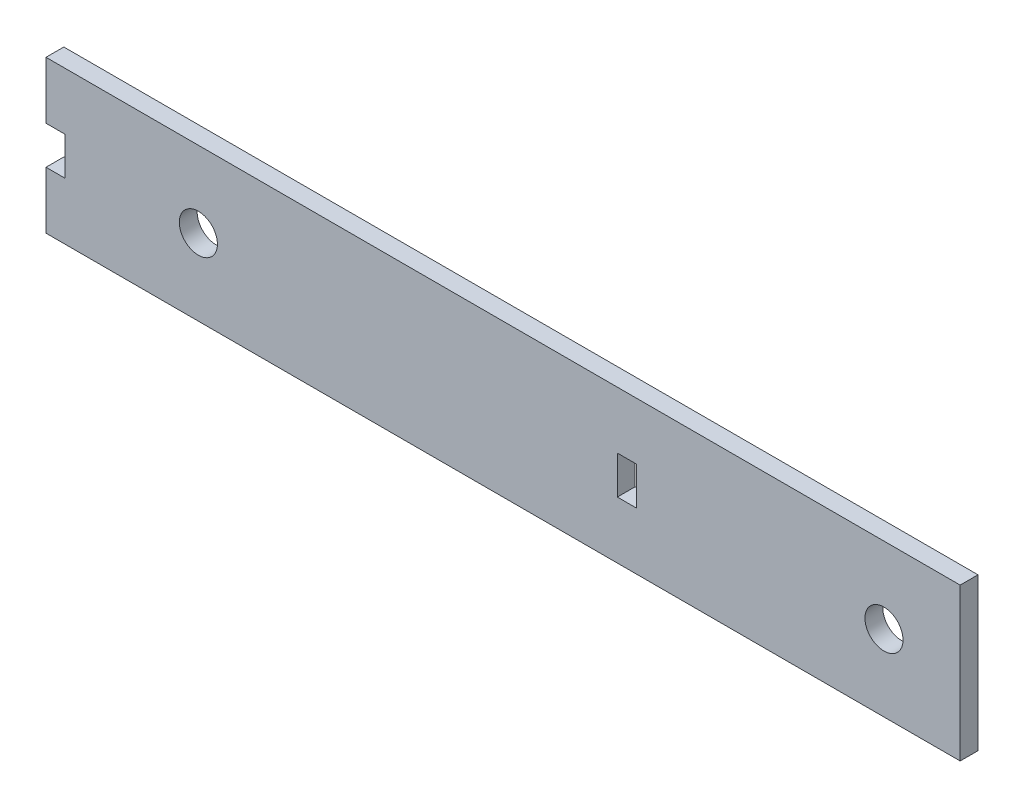
ISO-10303-21;
HEADER;
FILE_DESCRIPTION(('STEP AP214'),'2;1');
FILE_NAME('part.step','',(''),(''),'','','');
FILE_SCHEMA(('AUTOMOTIVE_DESIGN { 1 0 10303 214 1 1 1 1 }'));
ENDSEC;
DATA;
#1=APPLICATION_CONTEXT('core data for automotive mechanical design processes');
#2=APPLICATION_PROTOCOL_DEFINITION('international standard','automotive_design',2000,#1);
#3=PRODUCT_CONTEXT('',#1,'mechanical');
#4=PRODUCT('Part','Part','',(#3));
#5=PRODUCT_RELATED_PRODUCT_CATEGORY('part','',(#4));
#6=PRODUCT_DEFINITION_FORMATION('','',#4);
#7=PRODUCT_DEFINITION_CONTEXT('part definition',#1,'design');
#8=PRODUCT_DEFINITION('design','',#6,#7);
#9=PRODUCT_DEFINITION_SHAPE('','',#8);
#10=(LENGTH_UNIT() NAMED_UNIT(*) SI_UNIT(.MILLI.,.METRE.));
#11=(NAMED_UNIT(*) PLANE_ANGLE_UNIT() SI_UNIT($,.RADIAN.));
#12=(NAMED_UNIT(*) SI_UNIT($,.STERADIAN.) SOLID_ANGLE_UNIT());
#13=UNCERTAINTY_MEASURE_WITH_UNIT(LENGTH_MEASURE(1.E-05),#10,'distance_accuracy_value','');
#14=(GEOMETRIC_REPRESENTATION_CONTEXT(3) GLOBAL_UNCERTAINTY_ASSIGNED_CONTEXT((#13)) GLOBAL_UNIT_ASSIGNED_CONTEXT((#10,
#11,#12)) REPRESENTATION_CONTEXT('',''));
#15=CARTESIAN_POINT('',(0.,0.,0.));
#16=DIRECTION('',(0.,0.,1.));
#17=DIRECTION('',(1.,0.,0.));
#18=AXIS2_PLACEMENT_3D('',#15,#16,#17);
#19=CARTESIAN_POINT('',(-76.2,-12.7,2.9718));
#20=DIRECTION('',(1.,0.,0.));
#21=DIRECTION('',(0.,0.,-1.));
#22=AXIS2_PLACEMENT_3D('',#19,#20,#21);
#23=PLANE('',#22);
#24=DIRECTION('',(0.,-1.,0.));
#25=VECTOR('',#24,1.);
#26=CARTESIAN_POINT('',(-76.2,-12.7,2.9718));
#27=LINE('',#26,#25);
#28=CARTESIAN_POINT('',(-76.2,-3.175,2.9718));
#29=VERTEX_POINT('',#28);
#30=CARTESIAN_POINT('',(-76.2,-12.7,2.9718));
#31=VERTEX_POINT('',#30);
#32=EDGE_CURVE('E208',#29,#31,#27,.T.);
#33=ORIENTED_EDGE('',*,*,#32,.F.);
#34=DIRECTION('',(0.,0.,-1.));
#35=VECTOR('',#34,1.);
#36=CARTESIAN_POINT('',(-76.2,-3.175,2.9718));
#37=LINE('',#36,#35);
#38=CARTESIAN_POINT('',(-76.2,-3.175,0.));
#39=VERTEX_POINT('',#38);
#40=EDGE_CURVE('E201',#29,#39,#37,.T.);
#41=ORIENTED_EDGE('',*,*,#40,.T.);
#42=DIRECTION('',(0.,-1.,0.));
#43=VECTOR('',#42,1.);
#44=CARTESIAN_POINT('',(-76.2,-12.7,0.));
#45=LINE('',#44,#43);
#46=CARTESIAN_POINT('',(-76.2,-12.7,0.));
#47=VERTEX_POINT('',#46);
#48=EDGE_CURVE('E220',#39,#47,#45,.T.);
#49=ORIENTED_EDGE('',*,*,#48,.T.);
#50=DIRECTION('',(0.,0.,-1.));
#51=VECTOR('',#50,1.);
#52=CARTESIAN_POINT('',(-76.2,-12.7,2.9718));
#53=LINE('',#52,#51);
#54=EDGE_CURVE('E231',#31,#47,#53,.T.);
#55=ORIENTED_EDGE('',*,*,#54,.F.);
#56=EDGE_LOOP('',(#33,#41,#49,#55));
#57=FACE_BOUND('',#56,.T.);
#58=ADVANCED_FACE('F41',(#57),#23,.F.);
#59=CARTESIAN_POINT('',(-76.2,12.7,2.9718));
#60=DIRECTION('',(0.,-1.,0.));
#61=DIRECTION('',(1.,0.,0.));
#62=AXIS2_PLACEMENT_3D('',#59,#60,#61);
#63=PLANE('',#62);
#64=DIRECTION('',(-1.,0.,0.));
#65=VECTOR('',#64,1.);
#66=CARTESIAN_POINT('',(-76.2,12.7,0.));
#67=LINE('',#66,#65);
#68=CARTESIAN_POINT('',(76.2,12.7,0.));
#69=VERTEX_POINT('',#68);
#70=CARTESIAN_POINT('',(-76.2,12.7,0.));
#71=VERTEX_POINT('',#70);
#72=EDGE_CURVE('E204',#69,#71,#67,.T.);
#73=ORIENTED_EDGE('',*,*,#72,.T.);
#74=DIRECTION('',(0.,0.,-1.));
#75=VECTOR('',#74,1.);
#76=CARTESIAN_POINT('',(-76.2,12.7,2.9718));
#77=LINE('',#76,#75);
#78=CARTESIAN_POINT('',(-76.2,12.7,2.9718));
#79=VERTEX_POINT('',#78);
#80=EDGE_CURVE('E49',#79,#71,#77,.T.);
#81=ORIENTED_EDGE('',*,*,#80,.F.);
#82=DIRECTION('',(-1.,0.,0.));
#83=VECTOR('',#82,1.);
#84=CARTESIAN_POINT('',(-76.2,12.7,2.9718));
#85=LINE('',#84,#83);
#86=CARTESIAN_POINT('',(76.2,12.7,2.9718));
#87=VERTEX_POINT('',#86);
#88=EDGE_CURVE('E205',#87,#79,#85,.T.);
#89=ORIENTED_EDGE('',*,*,#88,.F.);
#90=DIRECTION('',(0.,0.,-1.));
#91=VECTOR('',#90,1.);
#92=CARTESIAN_POINT('',(76.2,12.7,2.9718));
#93=LINE('',#92,#91);
#94=EDGE_CURVE('E217',#87,#69,#93,.T.);
#95=ORIENTED_EDGE('',*,*,#94,.T.);
#96=EDGE_LOOP('',(#73,#81,#89,#95));
#97=FACE_BOUND('',#96,.T.);
#98=ADVANCED_FACE('F43',(#97),#63,.F.);
#99=CARTESIAN_POINT('',(-76.2,3.175,0.));
#100=VERTEX_POINT('',#99);
#101=EDGE_CURVE('E221',#71,#100,#45,.T.);
#102=ORIENTED_EDGE('',*,*,#101,.T.);
#103=DIRECTION('',(0.,0.,1.));
#104=VECTOR('',#103,1.);
#105=CARTESIAN_POINT('',(-76.2,3.175,2.9718));
#106=LINE('',#105,#104);
#107=CARTESIAN_POINT('',(-76.2,3.175,2.9718));
#108=VERTEX_POINT('',#107);
#109=EDGE_CURVE('E146',#100,#108,#106,.T.);
#110=ORIENTED_EDGE('',*,*,#109,.T.);
#111=EDGE_CURVE('E210',#79,#108,#27,.T.);
#112=ORIENTED_EDGE('',*,*,#111,.F.);
#113=ORIENTED_EDGE('',*,*,#80,.T.);
#114=EDGE_LOOP('',(#102,#110,#112,#113));
#115=FACE_BOUND('',#114,.T.);
#116=ADVANCED_FACE('F236',(#115),#23,.F.);
#117=CARTESIAN_POINT('',(-76.2,-12.7,2.9718));
#118=DIRECTION('',(0.,1.,0.));
#119=DIRECTION('',(-1.,0.,0.));
#120=AXIS2_PLACEMENT_3D('',#117,#118,#119);
#121=PLANE('',#120);
#122=DIRECTION('',(1.,0.,0.));
#123=VECTOR('',#122,1.);
#124=CARTESIAN_POINT('',(-76.2,-12.7,0.));
#125=LINE('',#124,#123);
#126=CARTESIAN_POINT('',(76.2,-12.7,0.));
#127=VERTEX_POINT('',#126);
#128=EDGE_CURVE('E223',#47,#127,#125,.T.);
#129=ORIENTED_EDGE('',*,*,#128,.T.);
#130=DIRECTION('',(0.,0.,-1.));
#131=VECTOR('',#130,1.);
#132=CARTESIAN_POINT('',(76.2,-12.7,2.9718));
#133=LINE('',#132,#131);
#134=CARTESIAN_POINT('',(76.2,-12.7,2.9718));
#135=VERTEX_POINT('',#134);
#136=EDGE_CURVE('E228',#135,#127,#133,.T.);
#137=ORIENTED_EDGE('',*,*,#136,.F.);
#138=DIRECTION('',(1.,0.,0.));
#139=VECTOR('',#138,1.);
#140=CARTESIAN_POINT('',(-76.2,-12.7,2.9718));
#141=LINE('',#140,#139);
#142=EDGE_CURVE('E213',#31,#135,#141,.T.);
#143=ORIENTED_EDGE('',*,*,#142,.F.);
#144=ORIENTED_EDGE('',*,*,#54,.T.);
#145=EDGE_LOOP('',(#129,#137,#143,#144));
#146=FACE_BOUND('',#145,.T.);
#147=ADVANCED_FACE('F249',(#146),#121,.F.);
#148=CARTESIAN_POINT('',(76.2,-12.7,2.9718));
#149=DIRECTION('',(-1.,0.,0.));
#150=DIRECTION('',(0.,0.,1.));
#151=AXIS2_PLACEMENT_3D('',#148,#149,#150);
#152=PLANE('',#151);
#153=DIRECTION('',(0.,1.,0.));
#154=VECTOR('',#153,1.);
#155=CARTESIAN_POINT('',(76.2,-12.7,0.));
#156=LINE('',#155,#154);
#157=EDGE_CURVE('E209',#127,#69,#156,.T.);
#158=ORIENTED_EDGE('',*,*,#157,.T.);
#159=ORIENTED_EDGE('',*,*,#94,.F.);
#160=DIRECTION('',(0.,1.,0.));
#161=VECTOR('',#160,1.);
#162=CARTESIAN_POINT('',(76.2,-12.7,2.9718));
#163=LINE('',#162,#161);
#164=EDGE_CURVE('E215',#135,#87,#163,.T.);
#165=ORIENTED_EDGE('',*,*,#164,.F.);
#166=ORIENTED_EDGE('',*,*,#136,.T.);
#167=EDGE_LOOP('',(#158,#159,#165,#166));
#168=FACE_BOUND('',#167,.T.);
#169=ADVANCED_FACE('F244',(#168),#152,.F.);
#170=CARTESIAN_POINT('',(0.,0.,2.9718));
#171=DIRECTION('',(0.,0.,1.));
#172=DIRECTION('',(1.,0.,0.));
#173=AXIS2_PLACEMENT_3D('',#170,#171,#172);
#174=PLANE('',#173);
#175=DIRECTION('',(1.,0.,0.));
#176=VECTOR('',#175,1.);
#177=CARTESIAN_POINT('',(-79.375,-3.175,2.9718));
#178=LINE('',#177,#176);
#179=CARTESIAN_POINT('',(-73.025,-3.175,2.9718));
#180=VERTEX_POINT('',#179);
#181=EDGE_CURVE('E152',#29,#180,#178,.T.);
#182=ORIENTED_EDGE('',*,*,#181,.F.);
#183=ORIENTED_EDGE('',*,*,#32,.T.);
#184=ORIENTED_EDGE('',*,*,#142,.T.);
#185=ORIENTED_EDGE('',*,*,#164,.T.);
#186=ORIENTED_EDGE('',*,*,#88,.T.);
#187=ORIENTED_EDGE('',*,*,#111,.T.);
#188=DIRECTION('',(-1.,0.,0.));
#189=VECTOR('',#188,1.);
#190=CARTESIAN_POINT('',(-79.375,3.175,2.9718));
#191=LINE('',#190,#189);
#192=CARTESIAN_POINT('',(-73.025,3.175,2.9718));
#193=VERTEX_POINT('',#192);
#194=EDGE_CURVE('E154',#193,#108,#191,.T.);
#195=ORIENTED_EDGE('',*,*,#194,.F.);
#196=DIRECTION('',(0.,1.,0.));
#197=VECTOR('',#196,1.);
#198=CARTESIAN_POINT('',(-73.025,-3.175,2.9718));
#199=LINE('',#198,#197);
#200=EDGE_CURVE('E137',#180,#193,#199,.T.);
#201=ORIENTED_EDGE('',*,*,#200,.F.);
#202=EDGE_LOOP('',(#182,#183,#184,#185,#186,#187,#195,#201));
#203=FACE_BOUND('',#202,.T.);
#204=DIRECTION('',(0.,1.,0.));
#205=VECTOR('',#204,1.);
#206=CARTESIAN_POINT('',(22.225,-3.16649195279477,2.9718));
#207=LINE('',#206,#205);
#208=CARTESIAN_POINT('',(22.225,-3.16649195279477,2.9718));
#209=VERTEX_POINT('',#208);
#210=CARTESIAN_POINT('',(22.225,3.18350804720523,2.9718));
#211=VERTEX_POINT('',#210);
#212=EDGE_CURVE('E56',#209,#211,#207,.T.);
#213=ORIENTED_EDGE('',*,*,#212,.F.);
#214=DIRECTION('',(1.,0.,0.));
#215=VECTOR('',#214,1.);
#216=CARTESIAN_POINT('',(19.05,-3.16649195279477,2.9718));
#217=LINE('',#216,#215);
#218=CARTESIAN_POINT('',(19.05,-3.16649195279477,2.9718));
#219=VERTEX_POINT('',#218);
#220=EDGE_CURVE('E170',#219,#209,#217,.T.);
#221=ORIENTED_EDGE('',*,*,#220,.F.);
#222=DIRECTION('',(0.,-1.,0.));
#223=VECTOR('',#222,1.);
#224=CARTESIAN_POINT('',(19.05,-3.16649195279477,2.9718));
#225=LINE('',#224,#223);
#226=CARTESIAN_POINT('',(19.05,3.18350804720523,2.9718));
#227=VERTEX_POINT('',#226);
#228=EDGE_CURVE('E173',#227,#219,#225,.T.);
#229=ORIENTED_EDGE('',*,*,#228,.F.);
#230=DIRECTION('',(-1.,0.,0.));
#231=VECTOR('',#230,1.);
#232=CARTESIAN_POINT('',(19.05,3.18350804720523,2.9718));
#233=LINE('',#232,#231);
#234=EDGE_CURVE('E177',#211,#227,#233,.T.);
#235=ORIENTED_EDGE('',*,*,#234,.F.);
#236=EDGE_LOOP('',(#213,#221,#229,#235));
#237=FACE_BOUND('',#236,.T.);
#238=CARTESIAN_POINT('',(63.5,0.,2.9718));
#239=DIRECTION('',(0.,0.,1.));
#240=DIRECTION('',(1.,0.,0.));
#241=AXIS2_PLACEMENT_3D('',#238,#239,#240);
#242=CIRCLE('',#241,3.175);
#243=CARTESIAN_POINT('',(66.675,0.,2.9718));
#244=VERTEX_POINT('',#243);
#245=EDGE_CURVE('E169',#244,#244,#242,.T.);
#246=ORIENTED_EDGE('',*,*,#245,.F.);
#247=EDGE_LOOP('',(#246));
#248=FACE_BOUND('',#247,.T.);
#249=CARTESIAN_POINT('',(-50.8,0.,2.9718));
#250=DIRECTION('',(0.,0.,1.));
#251=DIRECTION('',(1.,0.,0.));
#252=AXIS2_PLACEMENT_3D('',#249,#250,#251);
#253=CIRCLE('',#252,3.175);
#254=CARTESIAN_POINT('',(-47.625,0.,2.9718));
#255=VERTEX_POINT('',#254);
#256=EDGE_CURVE('E194',#255,#255,#253,.T.);
#257=ORIENTED_EDGE('',*,*,#256,.F.);
#258=EDGE_LOOP('',(#257));
#259=FACE_BOUND('',#258,.T.);
#260=ADVANCED_FACE('F257',(#203,#237,#248,#259),#174,.T.);
#261=CARTESIAN_POINT('',(0.,0.,0.));
#262=DIRECTION('',(0.,0.,1.));
#263=DIRECTION('',(1.,0.,0.));
#264=AXIS2_PLACEMENT_3D('',#261,#262,#263);
#265=PLANE('',#264);
#266=DIRECTION('',(1.,0.,0.));
#267=VECTOR('',#266,1.);
#268=CARTESIAN_POINT('',(19.05,-3.16649195279477,0.));
#269=LINE('',#268,#267);
#270=CARTESIAN_POINT('',(19.05,-3.16649195279477,0.));
#271=VERTEX_POINT('',#270);
#272=CARTESIAN_POINT('',(22.225,-3.16649195279477,0.));
#273=VERTEX_POINT('',#272);
#274=EDGE_CURVE('E162',#271,#273,#269,.T.);
#275=ORIENTED_EDGE('',*,*,#274,.T.);
#276=DIRECTION('',(0.,1.,0.));
#277=VECTOR('',#276,1.);
#278=CARTESIAN_POINT('',(22.225,-3.16649195279477,0.));
#279=LINE('',#278,#277);
#280=CARTESIAN_POINT('',(22.225,3.18350804720523,0.));
#281=VERTEX_POINT('',#280);
#282=EDGE_CURVE('E174',#273,#281,#279,.T.);
#283=ORIENTED_EDGE('',*,*,#282,.T.);
#284=DIRECTION('',(-1.,0.,0.));
#285=VECTOR('',#284,1.);
#286=CARTESIAN_POINT('',(19.05,3.18350804720523,0.));
#287=LINE('',#286,#285);
#288=CARTESIAN_POINT('',(19.05,3.18350804720523,0.));
#289=VERTEX_POINT('',#288);
#290=EDGE_CURVE('E184',#281,#289,#287,.T.);
#291=ORIENTED_EDGE('',*,*,#290,.T.);
#292=DIRECTION('',(0.,-1.,0.));
#293=VECTOR('',#292,1.);
#294=CARTESIAN_POINT('',(19.05,-3.16649195279477,0.));
#295=LINE('',#294,#293);
#296=EDGE_CURVE('E64',#289,#271,#295,.T.);
#297=ORIENTED_EDGE('',*,*,#296,.T.);
#298=EDGE_LOOP('',(#275,#283,#291,#297));
#299=FACE_BOUND('',#298,.T.);
#300=CARTESIAN_POINT('',(63.5,0.,0.));
#301=DIRECTION('',(0.,0.,1.));
#302=DIRECTION('',(1.,0.,0.));
#303=AXIS2_PLACEMENT_3D('',#300,#301,#302);
#304=CIRCLE('',#303,3.175);
#305=CARTESIAN_POINT('',(66.675,0.,0.));
#306=VERTEX_POINT('',#305);
#307=EDGE_CURVE('E191',#306,#306,#304,.T.);
#308=ORIENTED_EDGE('',*,*,#307,.T.);
#309=EDGE_LOOP('',(#308));
#310=FACE_BOUND('',#309,.T.);
#311=CARTESIAN_POINT('',(-50.8,0.,0.));
#312=DIRECTION('',(0.,0.,1.));
#313=DIRECTION('',(1.,0.,0.));
#314=AXIS2_PLACEMENT_3D('',#311,#312,#313);
#315=CIRCLE('',#314,3.175);
#316=CARTESIAN_POINT('',(-47.625,0.,0.));
#317=VERTEX_POINT('',#316);
#318=EDGE_CURVE('E197',#317,#317,#315,.T.);
#319=ORIENTED_EDGE('',*,*,#318,.T.);
#320=EDGE_LOOP('',(#319));
#321=FACE_BOUND('',#320,.T.);
#322=ORIENTED_EDGE('',*,*,#48,.F.);
#323=DIRECTION('',(1.,0.,0.));
#324=VECTOR('',#323,1.);
#325=CARTESIAN_POINT('',(0.,-3.175,0.));
#326=LINE('',#325,#324);
#327=CARTESIAN_POINT('',(-73.025,-3.175,0.));
#328=VERTEX_POINT('',#327);
#329=EDGE_CURVE('E11',#39,#328,#326,.T.);
#330=ORIENTED_EDGE('',*,*,#329,.T.);
#331=DIRECTION('',(0.,1.,0.));
#332=VECTOR('',#331,1.);
#333=CARTESIAN_POINT('',(-73.025,-3.175,0.));
#334=LINE('',#333,#332);
#335=CARTESIAN_POINT('',(-73.025,3.175,0.));
#336=VERTEX_POINT('',#335);
#337=EDGE_CURVE('E135',#328,#336,#334,.T.);
#338=ORIENTED_EDGE('',*,*,#337,.T.);
#339=DIRECTION('',(-1.,0.,0.));
#340=VECTOR('',#339,1.);
#341=CARTESIAN_POINT('',(-79.375,3.175,0.));
#342=LINE('',#341,#340);
#343=EDGE_CURVE('E141',#336,#100,#342,.T.);
#344=ORIENTED_EDGE('',*,*,#343,.T.);
#345=ORIENTED_EDGE('',*,*,#101,.F.);
#346=ORIENTED_EDGE('',*,*,#72,.F.);
#347=ORIENTED_EDGE('',*,*,#157,.F.);
#348=ORIENTED_EDGE('',*,*,#128,.F.);
#349=EDGE_LOOP('',(#322,#330,#338,#344,#345,#346,#347,#348));
#350=FACE_BOUND('',#349,.T.);
#351=ADVANCED_FACE('F151',(#299,#310,#321,#350),#265,.F.);
#352=CARTESIAN_POINT('',(-50.8,0.,0.));
#353=DIRECTION('',(0.,0.,1.));
#354=DIRECTION('',(1.,0.,0.));
#355=AXIS2_PLACEMENT_3D('',#352,#353,#354);
#356=CYLINDRICAL_SURFACE('',#355,3.175);
#357=ORIENTED_EDGE('',*,*,#318,.F.);
#358=EDGE_LOOP('',(#357));
#359=FACE_BOUND('',#358,.T.);
#360=ORIENTED_EDGE('',*,*,#256,.T.);
#361=EDGE_LOOP('',(#360));
#362=FACE_BOUND('',#361,.T.);
#363=ADVANCED_FACE('F268',(#359,#362),#356,.F.);
#364=CARTESIAN_POINT('',(63.5,0.,0.));
#365=DIRECTION('',(0.,0.,1.));
#366=DIRECTION('',(1.,0.,0.));
#367=AXIS2_PLACEMENT_3D('',#364,#365,#366);
#368=CYLINDRICAL_SURFACE('',#367,3.175);
#369=ORIENTED_EDGE('',*,*,#307,.F.);
#370=EDGE_LOOP('',(#369));
#371=FACE_BOUND('',#370,.T.);
#372=ORIENTED_EDGE('',*,*,#245,.T.);
#373=EDGE_LOOP('',(#372));
#374=FACE_BOUND('',#373,.T.);
#375=ADVANCED_FACE('F270',(#371,#374),#368,.F.);
#376=CARTESIAN_POINT('',(22.225,-3.16649195279477,0.));
#377=DIRECTION('',(1.,0.,0.));
#378=DIRECTION('',(0.,0.,-1.));
#379=AXIS2_PLACEMENT_3D('',#376,#377,#378);
#380=PLANE('',#379);
#381=ORIENTED_EDGE('',*,*,#212,.T.);
#382=DIRECTION('',(0.,0.,1.));
#383=VECTOR('',#382,1.);
#384=CARTESIAN_POINT('',(22.225,3.18350804720523,0.));
#385=LINE('',#384,#383);
#386=EDGE_CURVE('E160',#281,#211,#385,.T.);
#387=ORIENTED_EDGE('',*,*,#386,.F.);
#388=ORIENTED_EDGE('',*,*,#282,.F.);
#389=DIRECTION('',(0.,0.,1.));
#390=VECTOR('',#389,1.);
#391=CARTESIAN_POINT('',(22.225,-3.16649195279477,0.));
#392=LINE('',#391,#390);
#393=EDGE_CURVE('E167',#273,#209,#392,.T.);
#394=ORIENTED_EDGE('',*,*,#393,.T.);
#395=EDGE_LOOP('',(#381,#387,#388,#394));
#396=FACE_BOUND('',#395,.T.);
#397=ADVANCED_FACE('F277',(#396),#380,.F.);
#398=CARTESIAN_POINT('',(19.05,-3.16649195279477,0.));
#399=DIRECTION('',(0.,-1.,0.));
#400=DIRECTION('',(0.,0.,-1.));
#401=AXIS2_PLACEMENT_3D('',#398,#399,#400);
#402=PLANE('',#401);
#403=ORIENTED_EDGE('',*,*,#220,.T.);
#404=ORIENTED_EDGE('',*,*,#393,.F.);
#405=ORIENTED_EDGE('',*,*,#274,.F.);
#406=DIRECTION('',(0.,0.,1.));
#407=VECTOR('',#406,1.);
#408=CARTESIAN_POINT('',(19.05,-3.16649195279477,0.));
#409=LINE('',#408,#407);
#410=EDGE_CURVE('E165',#271,#219,#409,.T.);
#411=ORIENTED_EDGE('',*,*,#410,.T.);
#412=EDGE_LOOP('',(#403,#404,#405,#411));
#413=FACE_BOUND('',#412,.T.);
#414=ADVANCED_FACE('F337',(#413),#402,.F.);
#415=CARTESIAN_POINT('',(19.05,-3.16649195279477,0.));
#416=DIRECTION('',(-1.,0.,0.));
#417=DIRECTION('',(0.,0.,1.));
#418=AXIS2_PLACEMENT_3D('',#415,#416,#417);
#419=PLANE('',#418);
#420=ORIENTED_EDGE('',*,*,#228,.T.);
#421=ORIENTED_EDGE('',*,*,#410,.F.);
#422=ORIENTED_EDGE('',*,*,#296,.F.);
#423=DIRECTION('',(0.,0.,1.));
#424=VECTOR('',#423,1.);
#425=CARTESIAN_POINT('',(19.05,3.18350804720523,0.));
#426=LINE('',#425,#424);
#427=EDGE_CURVE('E163',#289,#227,#426,.T.);
#428=ORIENTED_EDGE('',*,*,#427,.T.);
#429=EDGE_LOOP('',(#420,#421,#422,#428));
#430=FACE_BOUND('',#429,.T.);
#431=ADVANCED_FACE('F346',(#430),#419,.F.);
#432=CARTESIAN_POINT('',(19.05,3.18350804720523,0.));
#433=DIRECTION('',(0.,1.,0.));
#434=DIRECTION('',(0.,0.,1.));
#435=AXIS2_PLACEMENT_3D('',#432,#433,#434);
#436=PLANE('',#435);
#437=ORIENTED_EDGE('',*,*,#234,.T.);
#438=ORIENTED_EDGE('',*,*,#427,.F.);
#439=ORIENTED_EDGE('',*,*,#290,.F.);
#440=ORIENTED_EDGE('',*,*,#386,.T.);
#441=EDGE_LOOP('',(#437,#438,#439,#440));
#442=FACE_BOUND('',#441,.T.);
#443=ADVANCED_FACE('F356',(#442),#436,.F.);
#444=CARTESIAN_POINT('',(-79.375,-3.175,0.));
#445=DIRECTION('',(0.,-1.,0.));
#446=DIRECTION('',(0.,0.,-1.));
#447=AXIS2_PLACEMENT_3D('',#444,#445,#446);
#448=PLANE('',#447);
#449=ORIENTED_EDGE('',*,*,#181,.T.);
#450=DIRECTION('',(0.,0.,1.));
#451=VECTOR('',#450,1.);
#452=CARTESIAN_POINT('',(-73.025,-3.175,0.));
#453=LINE('',#452,#451);
#454=EDGE_CURVE('E140',#328,#180,#453,.T.);
#455=ORIENTED_EDGE('',*,*,#454,.F.);
#456=ORIENTED_EDGE('',*,*,#329,.F.);
#457=ORIENTED_EDGE('',*,*,#40,.F.);
#458=EDGE_LOOP('',(#449,#455,#456,#457));
#459=FACE_BOUND('',#458,.T.);
#460=ADVANCED_FACE('F255',(#459),#448,.F.);
#461=CARTESIAN_POINT('',(-79.375,3.175,0.));
#462=DIRECTION('',(0.,1.,0.));
#463=DIRECTION('',(0.,0.,1.));
#464=AXIS2_PLACEMENT_3D('',#461,#462,#463);
#465=PLANE('',#464);
#466=ORIENTED_EDGE('',*,*,#343,.F.);
#467=DIRECTION('',(0.,0.,1.));
#468=VECTOR('',#467,1.);
#469=CARTESIAN_POINT('',(-73.025,3.175,0.));
#470=LINE('',#469,#468);
#471=EDGE_CURVE('E130',#336,#193,#470,.T.);
#472=ORIENTED_EDGE('',*,*,#471,.T.);
#473=ORIENTED_EDGE('',*,*,#194,.T.);
#474=ORIENTED_EDGE('',*,*,#109,.F.);
#475=EDGE_LOOP('',(#466,#472,#473,#474));
#476=FACE_BOUND('',#475,.T.);
#477=ADVANCED_FACE('F144',(#476),#465,.F.);
#478=CARTESIAN_POINT('',(-73.025,-3.175,0.));
#479=DIRECTION('',(1.,0.,0.));
#480=DIRECTION('',(0.,0.,-1.));
#481=AXIS2_PLACEMENT_3D('',#478,#479,#480);
#482=PLANE('',#481);
#483=ORIENTED_EDGE('',*,*,#200,.T.);
#484=ORIENTED_EDGE('',*,*,#471,.F.);
#485=ORIENTED_EDGE('',*,*,#337,.F.);
#486=ORIENTED_EDGE('',*,*,#454,.T.);
#487=EDGE_LOOP('',(#483,#484,#485,#486));
#488=FACE_BOUND('',#487,.T.);
#489=ADVANCED_FACE('F132',(#488),#482,.F.);
#490=CLOSED_SHELL('',(#58,#98,#116,#147,#169,#260,#351,#363,#375,#397,#414,#431,#443,#460,#477,#489));
#491=MANIFOLD_SOLID_BREP('B2',#490);
#492=ADVANCED_BREP_SHAPE_REPRESENTATION('',(#18,#491),#14);
#493=SHAPE_DEFINITION_REPRESENTATION(#9,#492);
ENDSEC;
END-ISO-10303-21;
